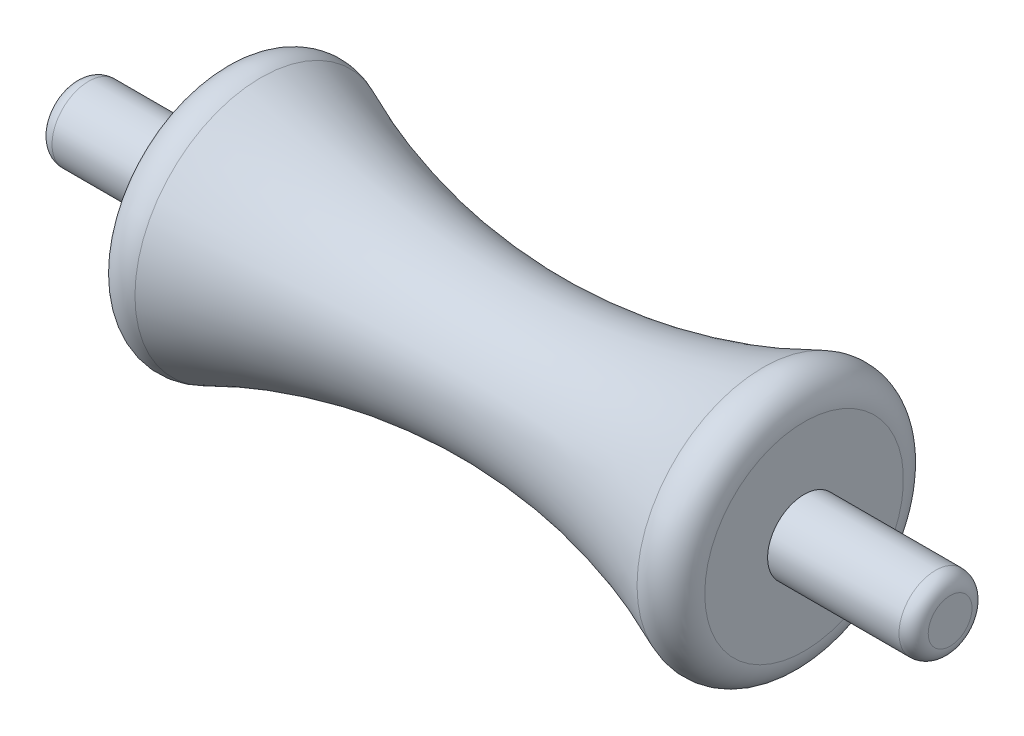
ISO-10303-21;
HEADER;
FILE_DESCRIPTION(('STEP AP214'),'2;1');
FILE_NAME('part.step','',(''),(''),'','','');
FILE_SCHEMA(('AUTOMOTIVE_DESIGN { 1 0 10303 214 1 1 1 1 }'));
ENDSEC;
DATA;
#1=APPLICATION_CONTEXT('core data for automotive mechanical design processes');
#2=APPLICATION_PROTOCOL_DEFINITION('international standard','automotive_design',2000,#1);
#3=PRODUCT_CONTEXT('',#1,'mechanical');
#4=PRODUCT('Part','Part','',(#3));
#5=PRODUCT_RELATED_PRODUCT_CATEGORY('part','',(#4));
#6=PRODUCT_DEFINITION_FORMATION('','',#4);
#7=PRODUCT_DEFINITION_CONTEXT('part definition',#1,'design');
#8=PRODUCT_DEFINITION('design','',#6,#7);
#9=PRODUCT_DEFINITION_SHAPE('','',#8);
#10=(LENGTH_UNIT() NAMED_UNIT(*) SI_UNIT(.MILLI.,.METRE.));
#11=(NAMED_UNIT(*) PLANE_ANGLE_UNIT() SI_UNIT($,.RADIAN.));
#12=(NAMED_UNIT(*) SI_UNIT($,.STERADIAN.) SOLID_ANGLE_UNIT());
#13=UNCERTAINTY_MEASURE_WITH_UNIT(LENGTH_MEASURE(1.E-05),#10,'distance_accuracy_value','');
#14=(GEOMETRIC_REPRESENTATION_CONTEXT(3) GLOBAL_UNCERTAINTY_ASSIGNED_CONTEXT((#13)) GLOBAL_UNIT_ASSIGNED_CONTEXT((#10,
#11,#12)) REPRESENTATION_CONTEXT('',''));
#15=CARTESIAN_POINT('',(0.,0.,0.));
#16=DIRECTION('',(0.,0.,1.));
#17=DIRECTION('',(1.,0.,0.));
#18=AXIS2_PLACEMENT_3D('',#15,#16,#17);
#19=CARTESIAN_POINT('',(-40.,-5.,0.));
#20=DIRECTION('',(-1.,0.,0.));
#21=DIRECTION('',(0.,0.,1.));
#22=AXIS2_PLACEMENT_3D('',#19,#20,#21);
#23=PLANE('',#22);
#24=CARTESIAN_POINT('',(-40.,0.,0.));
#25=DIRECTION('',(-1.,0.,0.));
#26=DIRECTION('',(0.,0.,1.));
#27=AXIS2_PLACEMENT_3D('',#24,#25,#26);
#28=CIRCLE('',#27,13.6058970195015);
#29=CARTESIAN_POINT('',(-40.,0.,13.6058970195015));
#30=VERTEX_POINT('',#29);
#31=EDGE_CURVE('E10',#30,#30,#28,.T.);
#32=ORIENTED_EDGE('',*,*,#31,.T.);
#33=EDGE_LOOP('',(#32));
#34=FACE_BOUND('',#33,.T.);
#35=CARTESIAN_POINT('',(-40.,0.,0.));
#36=DIRECTION('',(-1.,0.,0.));
#37=DIRECTION('',(0.,0.,1.));
#38=AXIS2_PLACEMENT_3D('',#35,#36,#37);
#39=CIRCLE('',#38,5.);
#40=CARTESIAN_POINT('',(-40.,0.,5.));
#41=VERTEX_POINT('',#40);
#42=EDGE_CURVE('E71',#41,#41,#39,.T.);
#43=ORIENTED_EDGE('',*,*,#42,.F.);
#44=EDGE_LOOP('',(#43));
#45=FACE_BOUND('',#44,.T.);
#46=ADVANCED_FACE('F37',(#34,#45),#23,.T.);
#47=CARTESIAN_POINT('',(-36.,0.,0.));
#48=DIRECTION('',(-1.,0.,0.));
#49=DIRECTION('',(0.,0.,1.));
#50=AXIS2_PLACEMENT_3D('',#47,#48,#49);
#51=TOROIDAL_SURFACE('',#50,13.6058970195015,4.00000000000001);
#52=CARTESIAN_POINT('',(-34.3820224719101,0.,0.));
#53=DIRECTION('',(-1.,0.,0.));
#54=DIRECTION('',(0.,0.,1.));
#55=AXIS2_PLACEMENT_3D('',#52,#53,#54);
#56=CIRCLE('',#55,17.2640589512092);
#57=CARTESIAN_POINT('',(-34.3820224719101,0.,17.2640589512092));
#58=VERTEX_POINT('',#57);
#59=EDGE_CURVE('E43',#58,#58,#56,.T.);
#60=ORIENTED_EDGE('',*,*,#59,.T.);
#61=EDGE_LOOP('',(#60));
#62=FACE_BOUND('',#61,.T.);
#63=ORIENTED_EDGE('',*,*,#31,.F.);
#64=EDGE_LOOP('',(#63));
#65=FACE_BOUND('',#64,.T.);
#66=ADVANCED_FACE('F79',(#62,#65),#51,.T.);
#67=CARTESIAN_POINT('',(0.,0.,0.));
#68=DIRECTION('',(-1.,0.,0.));
#69=DIRECTION('',(0.,0.,1.));
#70=AXIS2_PLACEMENT_3D('',#67,#68,#69);
#71=TOROIDAL_SURFACE('',#70,95.0000000000001,85.0000000000001);
#72=CARTESIAN_POINT('',(34.3820224719101,0.,0.));
#73=DIRECTION('',(-1.,0.,0.));
#74=DIRECTION('',(0.,0.,1.));
#75=AXIS2_PLACEMENT_3D('',#72,#73,#74);
#76=CIRCLE('',#75,17.2640589512091);
#77=CARTESIAN_POINT('',(34.3820224719101,0.,17.2640589512091));
#78=VERTEX_POINT('',#77);
#79=EDGE_CURVE('E47',#78,#78,#76,.T.);
#80=ORIENTED_EDGE('',*,*,#79,.T.);
#81=EDGE_LOOP('',(#80));
#82=FACE_BOUND('',#81,.T.);
#83=ORIENTED_EDGE('',*,*,#59,.F.);
#84=EDGE_LOOP('',(#83));
#85=FACE_BOUND('',#84,.T.);
#86=ADVANCED_FACE('F83',(#82,#85),#71,.F.);
#87=CARTESIAN_POINT('',(36.,0.,0.));
#88=DIRECTION('',(-1.,0.,0.));
#89=DIRECTION('',(0.,0.,1.));
#90=AXIS2_PLACEMENT_3D('',#87,#88,#89);
#91=TOROIDAL_SURFACE('',#90,13.6058970195013,4.);
#92=CARTESIAN_POINT('',(40.,0.,0.));
#93=DIRECTION('',(-1.,0.,0.));
#94=DIRECTION('',(0.,0.,1.));
#95=AXIS2_PLACEMENT_3D('',#92,#93,#94);
#96=CIRCLE('',#95,13.6058970195013);
#97=CARTESIAN_POINT('',(40.,0.,13.6058970195013));
#98=VERTEX_POINT('',#97);
#99=EDGE_CURVE('E51',#98,#98,#96,.T.);
#100=ORIENTED_EDGE('',*,*,#99,.T.);
#101=EDGE_LOOP('',(#100));
#102=FACE_BOUND('',#101,.T.);
#103=ORIENTED_EDGE('',*,*,#79,.F.);
#104=EDGE_LOOP('',(#103));
#105=FACE_BOUND('',#104,.T.);
#106=ADVANCED_FACE('F87',(#102,#105),#91,.T.);
#107=CARTESIAN_POINT('',(40.,-4.99999999999989,0.));
#108=DIRECTION('',(1.,0.,0.));
#109=DIRECTION('',(0.,0.,-1.));
#110=AXIS2_PLACEMENT_3D('',#107,#108,#109);
#111=PLANE('',#110);
#112=CARTESIAN_POINT('',(40.,0.,0.));
#113=DIRECTION('',(-1.,0.,0.));
#114=DIRECTION('',(0.,0.,1.));
#115=AXIS2_PLACEMENT_3D('',#112,#113,#114);
#116=CIRCLE('',#115,4.99999999999989);
#117=CARTESIAN_POINT('',(40.,0.,4.99999999999989));
#118=VERTEX_POINT('',#117);
#119=EDGE_CURVE('E56',#118,#118,#116,.T.);
#120=ORIENTED_EDGE('',*,*,#119,.T.);
#121=EDGE_LOOP('',(#120));
#122=FACE_BOUND('',#121,.T.);
#123=ORIENTED_EDGE('',*,*,#99,.F.);
#124=EDGE_LOOP('',(#123));
#125=FACE_BOUND('',#124,.T.);
#126=ADVANCED_FACE('F94',(#122,#125),#111,.T.);
#127=CARTESIAN_POINT('',(-60.,0.,0.));
#128=DIRECTION('',(-1.,0.,0.));
#129=DIRECTION('',(0.,0.,1.));
#130=AXIS2_PLACEMENT_3D('',#127,#128,#129);
#131=CYLINDRICAL_SURFACE('',#130,4.99999999999986);
#132=CARTESIAN_POINT('',(58.,0.,0.));
#133=DIRECTION('',(-1.,0.,0.));
#134=DIRECTION('',(0.,0.,1.));
#135=AXIS2_PLACEMENT_3D('',#132,#133,#134);
#136=CIRCLE('',#135,4.99999999999984);
#137=CARTESIAN_POINT('',(58.,0.,4.99999999999984));
#138=VERTEX_POINT('',#137);
#139=EDGE_CURVE('E59',#138,#138,#136,.T.);
#140=ORIENTED_EDGE('',*,*,#139,.T.);
#141=EDGE_LOOP('',(#140));
#142=FACE_BOUND('',#141,.T.);
#143=ORIENTED_EDGE('',*,*,#119,.F.);
#144=EDGE_LOOP('',(#143));
#145=FACE_BOUND('',#144,.T.);
#146=ADVANCED_FACE('F98',(#142,#145),#131,.T.);
#147=CARTESIAN_POINT('',(58.,0.,0.));
#148=DIRECTION('',(-1.,0.,0.));
#149=DIRECTION('',(0.,0.,1.));
#150=AXIS2_PLACEMENT_3D('',#147,#148,#149);
#151=TOROIDAL_SURFACE('',#150,2.99999999999984,2.);
#152=CARTESIAN_POINT('',(60.,0.,0.));
#153=DIRECTION('',(-1.,0.,0.));
#154=DIRECTION('',(0.,0.,1.));
#155=AXIS2_PLACEMENT_3D('',#152,#153,#154);
#156=CIRCLE('',#155,2.99999999999983);
#157=CARTESIAN_POINT('',(60.,0.,2.99999999999983));
#158=VERTEX_POINT('',#157);
#159=EDGE_CURVE('E62',#158,#158,#156,.T.);
#160=ORIENTED_EDGE('',*,*,#159,.T.);
#161=EDGE_LOOP('',(#160));
#162=FACE_BOUND('',#161,.T.);
#163=ORIENTED_EDGE('',*,*,#139,.F.);
#164=EDGE_LOOP('',(#163));
#165=FACE_BOUND('',#164,.T.);
#166=ADVANCED_FACE('F102',(#162,#165),#151,.T.);
#167=CARTESIAN_POINT('',(60.,0.,0.));
#168=DIRECTION('',(1.,0.,0.));
#169=DIRECTION('',(0.,0.,-1.));
#170=AXIS2_PLACEMENT_3D('',#167,#168,#169);
#171=PLANE('',#170);
#172=ORIENTED_EDGE('',*,*,#159,.F.);
#173=EDGE_LOOP('',(#172));
#174=FACE_BOUND('',#173,.T.);
#175=ADVANCED_FACE('F106',(#174),#171,.T.);
#176=CARTESIAN_POINT('',(-60.,0.,0.));
#177=DIRECTION('',(-1.,0.,0.));
#178=DIRECTION('',(0.,0.,1.));
#179=AXIS2_PLACEMENT_3D('',#176,#177,#178);
#180=PLANE('',#179);
#181=CARTESIAN_POINT('',(-60.,0.,0.));
#182=DIRECTION('',(-1.,0.,0.));
#183=DIRECTION('',(0.,0.,1.));
#184=AXIS2_PLACEMENT_3D('',#181,#182,#183);
#185=CIRCLE('',#184,2.99999999999999);
#186=CARTESIAN_POINT('',(-60.,0.,2.99999999999999));
#187=VERTEX_POINT('',#186);
#188=EDGE_CURVE('E65',#187,#187,#185,.T.);
#189=ORIENTED_EDGE('',*,*,#188,.T.);
#190=EDGE_LOOP('',(#189));
#191=FACE_BOUND('',#190,.T.);
#192=ADVANCED_FACE('F110',(#191),#180,.T.);
#193=CARTESIAN_POINT('',(-58.,0.,0.));
#194=DIRECTION('',(-1.,0.,0.));
#195=DIRECTION('',(0.,0.,1.));
#196=AXIS2_PLACEMENT_3D('',#193,#194,#195);
#197=TOROIDAL_SURFACE('',#196,3.,2.);
#198=CARTESIAN_POINT('',(-58.,0.,0.));
#199=DIRECTION('',(-1.,0.,0.));
#200=DIRECTION('',(0.,0.,1.));
#201=AXIS2_PLACEMENT_3D('',#198,#199,#200);
#202=CIRCLE('',#201,5.);
#203=CARTESIAN_POINT('',(-58.,0.,5.));
#204=VERTEX_POINT('',#203);
#205=EDGE_CURVE('E68',#204,#204,#202,.T.);
#206=ORIENTED_EDGE('',*,*,#205,.T.);
#207=EDGE_LOOP('',(#206));
#208=FACE_BOUND('',#207,.T.);
#209=ORIENTED_EDGE('',*,*,#188,.F.);
#210=EDGE_LOOP('',(#209));
#211=FACE_BOUND('',#210,.T.);
#212=ADVANCED_FACE('F114',(#208,#211),#197,.T.);
#213=CARTESIAN_POINT('',(-60.,0.,0.));
#214=DIRECTION('',(-1.,0.,0.));
#215=DIRECTION('',(0.,0.,1.));
#216=AXIS2_PLACEMENT_3D('',#213,#214,#215);
#217=CYLINDRICAL_SURFACE('',#216,5.);
#218=ORIENTED_EDGE('',*,*,#42,.T.);
#219=EDGE_LOOP('',(#218));
#220=FACE_BOUND('',#219,.T.);
#221=ORIENTED_EDGE('',*,*,#205,.F.);
#222=EDGE_LOOP('',(#221));
#223=FACE_BOUND('',#222,.T.);
#224=ADVANCED_FACE('F75',(#220,#223),#217,.T.);
#225=CLOSED_SHELL('',(#46,#66,#86,#106,#126,#146,#166,#175,#192,#212,#224));
#226=MANIFOLD_SOLID_BREP('B2',#225);
#227=ADVANCED_BREP_SHAPE_REPRESENTATION('',(#18,#226),#14);
#228=SHAPE_DEFINITION_REPRESENTATION(#9,#227);
ENDSEC;
END-ISO-10303-21;
